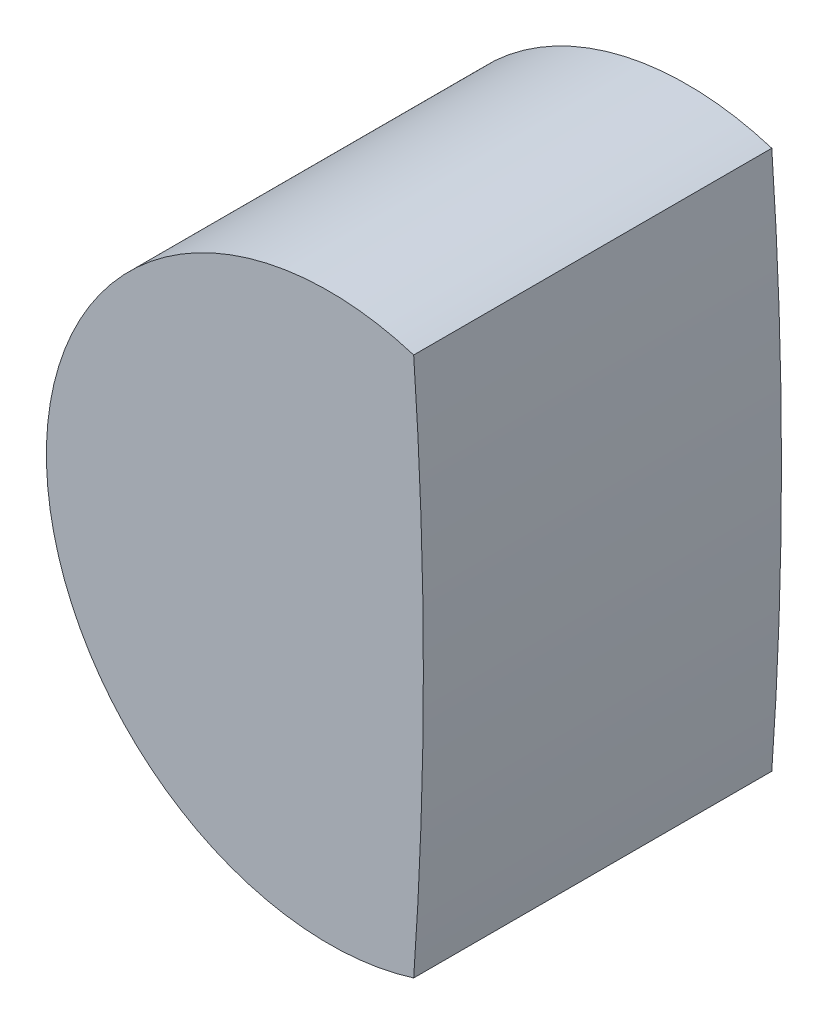
ISO-10303-21;
HEADER;
FILE_DESCRIPTION(('STEP AP214'),'2;1');
FILE_NAME('part.step','',(''),(''),'','','');
FILE_SCHEMA(('AUTOMOTIVE_DESIGN { 1 0 10303 214 1 1 1 1 }'));
ENDSEC;
DATA;
#1=APPLICATION_CONTEXT('core data for automotive mechanical design processes');
#2=APPLICATION_PROTOCOL_DEFINITION('international standard','automotive_design',2000,#1);
#3=PRODUCT_CONTEXT('',#1,'mechanical');
#4=PRODUCT('Part','Part','',(#3));
#5=PRODUCT_RELATED_PRODUCT_CATEGORY('part','',(#4));
#6=PRODUCT_DEFINITION_FORMATION('','',#4);
#7=PRODUCT_DEFINITION_CONTEXT('part definition',#1,'design');
#8=PRODUCT_DEFINITION('design','',#6,#7);
#9=PRODUCT_DEFINITION_SHAPE('','',#8);
#10=(LENGTH_UNIT() NAMED_UNIT(*) SI_UNIT(.MILLI.,.METRE.));
#11=(NAMED_UNIT(*) PLANE_ANGLE_UNIT() SI_UNIT($,.RADIAN.));
#12=(NAMED_UNIT(*) SI_UNIT($,.STERADIAN.) SOLID_ANGLE_UNIT());
#13=UNCERTAINTY_MEASURE_WITH_UNIT(LENGTH_MEASURE(1.E-05),#10,'distance_accuracy_value','');
#14=(GEOMETRIC_REPRESENTATION_CONTEXT(3) GLOBAL_UNCERTAINTY_ASSIGNED_CONTEXT((#13)) GLOBAL_UNIT_ASSIGNED_CONTEXT((#10,
#11,#12)) REPRESENTATION_CONTEXT('',''));
#15=CARTESIAN_POINT('',(0.,0.,0.));
#16=DIRECTION('',(0.,0.,1.));
#17=DIRECTION('',(1.,0.,0.));
#18=AXIS2_PLACEMENT_3D('',#15,#16,#17);
#19=CARTESIAN_POINT('',(-19.5,0.,1.9));
#20=DIRECTION('',(0.,0.,-1.));
#21=DIRECTION('',(-1.,0.,0.));
#22=AXIS2_PLACEMENT_3D('',#19,#20,#21);
#23=CYLINDRICAL_SURFACE('',#22,20.);
#24=CARTESIAN_POINT('',(-19.5,0.,0.));
#25=DIRECTION('',(0.,0.,1.));
#26=DIRECTION('',(1.,0.,0.));
#27=AXIS2_PLACEMENT_3D('',#24,#25,#26);
#28=CIRCLE('',#27,20.);
#29=CARTESIAN_POINT('',(0.448717948717953,-1.4313113576362,0.));
#30=VERTEX_POINT('',#29);
#31=CARTESIAN_POINT('',(0.448717948717953,1.4313113576362,0.));
#32=VERTEX_POINT('',#31);
#33=EDGE_CURVE('E70',#30,#32,#28,.T.);
#34=ORIENTED_EDGE('',*,*,#33,.T.);
#35=DIRECTION('',(0.,0.,-1.));
#36=VECTOR('',#35,1.);
#37=CARTESIAN_POINT('',(0.448717948717953,1.4313113576362,1.9));
#38=LINE('',#37,#36);
#39=CARTESIAN_POINT('',(0.448717948717953,1.4313113576362,1.9));
#40=VERTEX_POINT('',#39);
#41=EDGE_CURVE('E11',#40,#32,#38,.T.);
#42=ORIENTED_EDGE('',*,*,#41,.F.);
#43=CARTESIAN_POINT('',(-19.5,0.,1.9));
#44=DIRECTION('',(0.,0.,1.));
#45=DIRECTION('',(1.,0.,0.));
#46=AXIS2_PLACEMENT_3D('',#43,#44,#45);
#47=CIRCLE('',#46,20.);
#48=CARTESIAN_POINT('',(0.448717948717953,-1.4313113576362,1.9));
#49=VERTEX_POINT('',#48);
#50=EDGE_CURVE('E68',#49,#40,#47,.T.);
#51=ORIENTED_EDGE('',*,*,#50,.F.);
#52=DIRECTION('',(0.,0.,-1.));
#53=VECTOR('',#52,1.);
#54=CARTESIAN_POINT('',(0.448717948717953,-1.4313113576362,1.9));
#55=LINE('',#54,#53);
#56=EDGE_CURVE('E50',#49,#30,#55,.T.);
#57=ORIENTED_EDGE('',*,*,#56,.T.);
#58=EDGE_LOOP('',(#34,#42,#51,#57));
#59=FACE_BOUND('',#58,.T.);
#60=ADVANCED_FACE('F39',(#59),#23,.T.);
#61=CARTESIAN_POINT('',(0.,0.,1.9));
#62=DIRECTION('',(0.,0.,-1.));
#63=DIRECTION('',(-1.,0.,0.));
#64=AXIS2_PLACEMENT_3D('',#61,#62,#63);
#65=CYLINDRICAL_SURFACE('',#64,1.50000000000001);
#66=CARTESIAN_POINT('',(0.,0.,0.));
#67=DIRECTION('',(0.,0.,1.));
#68=DIRECTION('',(1.,0.,0.));
#69=AXIS2_PLACEMENT_3D('',#66,#67,#68);
#70=CIRCLE('',#69,1.50000000000001);
#71=EDGE_CURVE('E65',#32,#30,#70,.T.);
#72=ORIENTED_EDGE('',*,*,#71,.T.);
#73=ORIENTED_EDGE('',*,*,#56,.F.);
#74=CARTESIAN_POINT('',(0.,0.,1.9));
#75=DIRECTION('',(0.,0.,1.));
#76=DIRECTION('',(1.,0.,0.));
#77=AXIS2_PLACEMENT_3D('',#74,#75,#76);
#78=CIRCLE('',#77,1.50000000000001);
#79=EDGE_CURVE('E53',#40,#49,#78,.T.);
#80=ORIENTED_EDGE('',*,*,#79,.F.);
#81=ORIENTED_EDGE('',*,*,#41,.T.);
#82=EDGE_LOOP('',(#72,#73,#80,#81));
#83=FACE_BOUND('',#82,.T.);
#84=ADVANCED_FACE('F63',(#83),#65,.T.);
#85=CARTESIAN_POINT('',(-9.75,0.,1.9));
#86=DIRECTION('',(0.,0.,1.));
#87=DIRECTION('',(1.,0.,0.));
#88=AXIS2_PLACEMENT_3D('',#85,#86,#87);
#89=PLANE('',#88);
#90=ORIENTED_EDGE('',*,*,#50,.T.);
#91=ORIENTED_EDGE('',*,*,#79,.T.);
#92=EDGE_LOOP('',(#90,#91));
#93=FACE_BOUND('',#92,.T.);
#94=ADVANCED_FACE('F80',(#93),#89,.T.);
#95=CARTESIAN_POINT('',(-9.75,0.,0.));
#96=DIRECTION('',(0.,0.,1.));
#97=DIRECTION('',(1.,0.,0.));
#98=AXIS2_PLACEMENT_3D('',#95,#96,#97);
#99=PLANE('',#98);
#100=ORIENTED_EDGE('',*,*,#33,.F.);
#101=ORIENTED_EDGE('',*,*,#71,.F.);
#102=EDGE_LOOP('',(#100,#101));
#103=FACE_BOUND('',#102,.T.);
#104=ADVANCED_FACE('F71',(#103),#99,.F.);
#105=CLOSED_SHELL('',(#60,#84,#94,#104));
#106=MANIFOLD_SOLID_BREP('B2',#105);
#107=ADVANCED_BREP_SHAPE_REPRESENTATION('',(#18,#106),#14);
#108=SHAPE_DEFINITION_REPRESENTATION(#9,#107);
ENDSEC;
END-ISO-10303-21;
